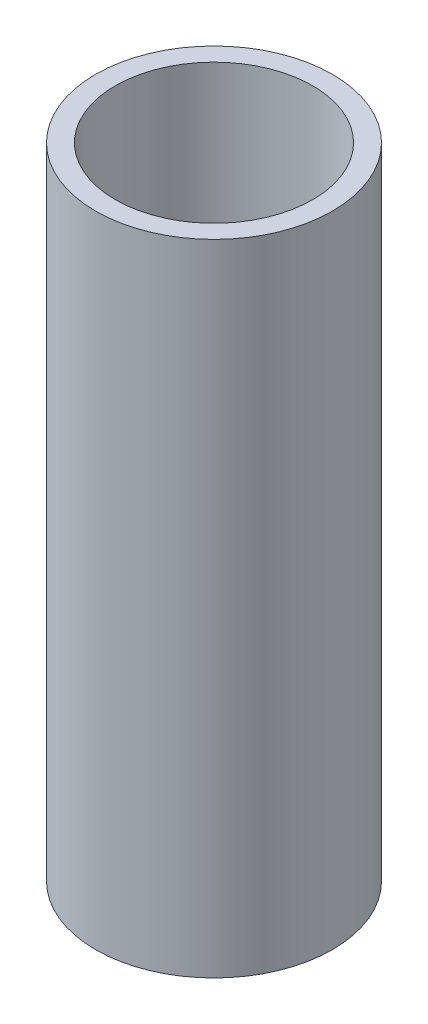
ISO-10303-21;
HEADER;
FILE_DESCRIPTION(('STEP AP214'),'2;1');
FILE_NAME('part.step','',(''),(''),'','','');
FILE_SCHEMA(('AUTOMOTIVE_DESIGN { 1 0 10303 214 1 1 1 1 }'));
ENDSEC;
DATA;
#1=APPLICATION_CONTEXT('core data for automotive mechanical design processes');
#2=APPLICATION_PROTOCOL_DEFINITION('international standard','automotive_design',2000,#1);
#3=PRODUCT_CONTEXT('',#1,'mechanical');
#4=PRODUCT('Part','Part','',(#3));
#5=PRODUCT_RELATED_PRODUCT_CATEGORY('part','',(#4));
#6=PRODUCT_DEFINITION_FORMATION('','',#4);
#7=PRODUCT_DEFINITION_CONTEXT('part definition',#1,'design');
#8=PRODUCT_DEFINITION('design','',#6,#7);
#9=PRODUCT_DEFINITION_SHAPE('','',#8);
#10=(LENGTH_UNIT() NAMED_UNIT(*) SI_UNIT(.MILLI.,.METRE.));
#11=(NAMED_UNIT(*) PLANE_ANGLE_UNIT() SI_UNIT($,.RADIAN.));
#12=(NAMED_UNIT(*) SI_UNIT($,.STERADIAN.) SOLID_ANGLE_UNIT());
#13=UNCERTAINTY_MEASURE_WITH_UNIT(LENGTH_MEASURE(1.E-05),#10,'distance_accuracy_value','');
#14=(GEOMETRIC_REPRESENTATION_CONTEXT(3) GLOBAL_UNCERTAINTY_ASSIGNED_CONTEXT((#13)) GLOBAL_UNIT_ASSIGNED_CONTEXT((#10,
#11,#12)) REPRESENTATION_CONTEXT('',''));
#15=CARTESIAN_POINT('',(0.,0.,0.));
#16=DIRECTION('',(0.,0.,1.));
#17=DIRECTION('',(1.,0.,0.));
#18=AXIS2_PLACEMENT_3D('',#15,#16,#17);
#19=CARTESIAN_POINT('',(0.,162.,0.));
#20=DIRECTION('',(0.,1.,0.));
#21=DIRECTION('',(0.,0.,1.));
#22=AXIS2_PLACEMENT_3D('',#19,#20,#21);
#23=PLANE('',#22);
#24=CARTESIAN_POINT('',(0.,162.,0.));
#25=DIRECTION('',(0.,1.,0.));
#26=DIRECTION('',(0.,0.,1.));
#27=AXIS2_PLACEMENT_3D('',#24,#25,#26);
#28=CIRCLE('',#27,30.);
#29=CARTESIAN_POINT('',(0.,162.,30.));
#30=VERTEX_POINT('',#29);
#31=EDGE_CURVE('E10',#30,#30,#28,.T.);
#32=ORIENTED_EDGE('',*,*,#31,.T.);
#33=EDGE_LOOP('',(#32));
#34=FACE_BOUND('',#33,.T.);
#35=CARTESIAN_POINT('',(0.,162.,0.));
#36=DIRECTION('',(0.,1.,0.));
#37=DIRECTION('',(0.,0.,1.));
#38=AXIS2_PLACEMENT_3D('',#35,#36,#37);
#39=CIRCLE('',#38,25.);
#40=CARTESIAN_POINT('',(0.,162.,25.));
#41=VERTEX_POINT('',#40);
#42=EDGE_CURVE('E46',#41,#41,#39,.T.);
#43=ORIENTED_EDGE('',*,*,#42,.F.);
#44=EDGE_LOOP('',(#43));
#45=FACE_BOUND('',#44,.T.);
#46=ADVANCED_FACE('F34',(#34,#45),#23,.T.);
#47=CARTESIAN_POINT('',(0.,0.,0.));
#48=DIRECTION('',(0.,1.,0.));
#49=DIRECTION('',(0.,0.,1.));
#50=AXIS2_PLACEMENT_3D('',#47,#48,#49);
#51=PLANE('',#50);
#52=CARTESIAN_POINT('',(0.,0.,0.));
#53=DIRECTION('',(0.,1.,0.));
#54=DIRECTION('',(0.,0.,1.));
#55=AXIS2_PLACEMENT_3D('',#52,#53,#54);
#56=CIRCLE('',#55,30.);
#57=CARTESIAN_POINT('',(0.,0.,30.));
#58=VERTEX_POINT('',#57);
#59=EDGE_CURVE('E39',#58,#58,#56,.T.);
#60=ORIENTED_EDGE('',*,*,#59,.F.);
#61=EDGE_LOOP('',(#60));
#62=FACE_BOUND('',#61,.T.);
#63=CARTESIAN_POINT('',(0.,0.,0.));
#64=DIRECTION('',(0.,1.,0.));
#65=DIRECTION('',(0.,0.,1.));
#66=AXIS2_PLACEMENT_3D('',#63,#64,#65);
#67=CIRCLE('',#66,25.);
#68=CARTESIAN_POINT('',(0.,0.,25.));
#69=VERTEX_POINT('',#68);
#70=EDGE_CURVE('E48',#69,#69,#67,.T.);
#71=ORIENTED_EDGE('',*,*,#70,.T.);
#72=EDGE_LOOP('',(#71));
#73=FACE_BOUND('',#72,.T.);
#74=ADVANCED_FACE('F59',(#62,#73),#51,.F.);
#75=CARTESIAN_POINT('',(0.,162.,0.));
#76=DIRECTION('',(0.,-1.,0.));
#77=DIRECTION('',(0.,0.,-1.));
#78=AXIS2_PLACEMENT_3D('',#75,#76,#77);
#79=CYLINDRICAL_SURFACE('',#78,30.);
#80=ORIENTED_EDGE('',*,*,#31,.F.);
#81=EDGE_LOOP('',(#80));
#82=FACE_BOUND('',#81,.T.);
#83=ORIENTED_EDGE('',*,*,#59,.T.);
#84=EDGE_LOOP('',(#83));
#85=FACE_BOUND('',#84,.T.);
#86=ADVANCED_FACE('F40',(#82,#85),#79,.T.);
#87=CARTESIAN_POINT('',(0.,162.,0.));
#88=DIRECTION('',(0.,-1.,0.));
#89=DIRECTION('',(0.,0.,-1.));
#90=AXIS2_PLACEMENT_3D('',#87,#88,#89);
#91=CYLINDRICAL_SURFACE('',#90,25.);
#92=ORIENTED_EDGE('',*,*,#42,.T.);
#93=EDGE_LOOP('',(#92));
#94=FACE_BOUND('',#93,.T.);
#95=ORIENTED_EDGE('',*,*,#70,.F.);
#96=EDGE_LOOP('',(#95));
#97=FACE_BOUND('',#96,.T.);
#98=ADVANCED_FACE('F53',(#94,#97),#91,.F.);
#99=CLOSED_SHELL('',(#46,#74,#86,#98));
#100=MANIFOLD_SOLID_BREP('B2',#99);
#101=ADVANCED_BREP_SHAPE_REPRESENTATION('',(#18,#100),#14);
#102=SHAPE_DEFINITION_REPRESENTATION(#9,#101);
ENDSEC;
END-ISO-10303-21;
